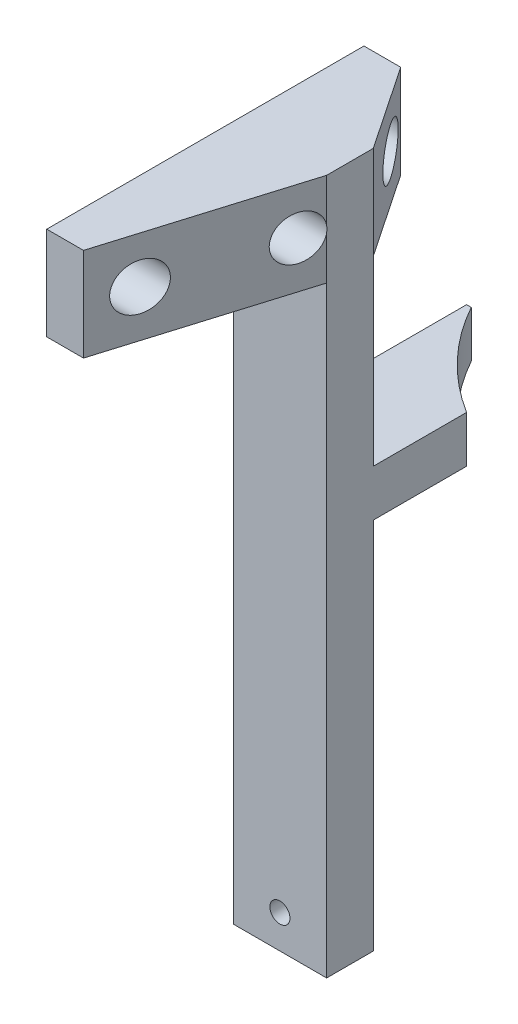
ISO-10303-21;
HEADER;
FILE_DESCRIPTION(('STEP AP214'),'2;1');
FILE_NAME('part.step','',(''),(''),'','','');
FILE_SCHEMA(('AUTOMOTIVE_DESIGN { 1 0 10303 214 1 1 1 1 }'));
ENDSEC;
DATA;
#1=APPLICATION_CONTEXT('core data for automotive mechanical design processes');
#2=APPLICATION_PROTOCOL_DEFINITION('international standard','automotive_design',2000,#1);
#3=PRODUCT_CONTEXT('',#1,'mechanical');
#4=PRODUCT('Part','Part','',(#3));
#5=PRODUCT_RELATED_PRODUCT_CATEGORY('part','',(#4));
#6=PRODUCT_DEFINITION_FORMATION('','',#4);
#7=PRODUCT_DEFINITION_CONTEXT('part definition',#1,'design');
#8=PRODUCT_DEFINITION('design','',#6,#7);
#9=PRODUCT_DEFINITION_SHAPE('','',#8);
#10=(LENGTH_UNIT() NAMED_UNIT(*) SI_UNIT(.MILLI.,.METRE.));
#11=(NAMED_UNIT(*) PLANE_ANGLE_UNIT() SI_UNIT($,.RADIAN.));
#12=(NAMED_UNIT(*) SI_UNIT($,.STERADIAN.) SOLID_ANGLE_UNIT());
#13=UNCERTAINTY_MEASURE_WITH_UNIT(LENGTH_MEASURE(1.E-05),#10,'distance_accuracy_value','');
#14=(GEOMETRIC_REPRESENTATION_CONTEXT(3) GLOBAL_UNCERTAINTY_ASSIGNED_CONTEXT((#13)) GLOBAL_UNIT_ASSIGNED_CONTEXT((#10,
#11,#12)) REPRESENTATION_CONTEXT('',''));
#15=CARTESIAN_POINT('',(0.,0.,0.));
#16=DIRECTION('',(0.,0.,1.));
#17=DIRECTION('',(1.,0.,0.));
#18=AXIS2_PLACEMENT_3D('',#15,#16,#17);
#19=CARTESIAN_POINT('',(0.,0.,0.));
#20=DIRECTION('',(0.,0.,1.));
#21=DIRECTION('',(1.,0.,0.));
#22=AXIS2_PLACEMENT_3D('',#19,#20,#21);
#23=PLANE('',#22);
#24=CARTESIAN_POINT('',(20.,-124.653388527127,0.));
#25=DIRECTION('',(0.,0.,1.));
#26=DIRECTION('',(1.,0.,0.));
#27=AXIS2_PLACEMENT_3D('',#24,#25,#26);
#28=CIRCLE('',#27,2.15);
#29=CARTESIAN_POINT('',(22.15,-124.653388527127,0.));
#30=VERTEX_POINT('',#29);
#31=EDGE_CURVE('E249',#30,#30,#28,.T.);
#32=ORIENTED_EDGE('',*,*,#31,.T.);
#33=EDGE_LOOP('',(#32));
#34=FACE_BOUND('',#33,.T.);
#35=DIRECTION('',(-1.,0.,0.));
#36=VECTOR('',#35,1.);
#37=CARTESIAN_POINT('',(30.0137626059961,-51.8033885271269,0.));
#38=LINE('',#37,#36);
#39=CARTESIAN_POINT('',(30.0137626059961,-51.8033885271269,0.));
#40=VERTEX_POINT('',#39);
#41=CARTESIAN_POINT('',(10.0137626059961,-51.8033885271269,0.));
#42=VERTEX_POINT('',#41);
#43=EDGE_CURVE('E336',#40,#42,#38,.T.);
#44=ORIENTED_EDGE('',*,*,#43,.F.);
#45=DIRECTION('',(0.,1.,0.));
#46=VECTOR('',#45,1.);
#47=CARTESIAN_POINT('',(30.0137626059961,17.2116114728731,0.));
#48=LINE('',#47,#46);
#49=CARTESIAN_POINT('',(30.0137626059961,-131.803388527127,0.));
#50=VERTEX_POINT('',#49);
#51=EDGE_CURVE('E166',#50,#40,#48,.T.);
#52=ORIENTED_EDGE('',*,*,#51,.F.);
#53=DIRECTION('',(1.,0.,0.));
#54=VECTOR('',#53,1.);
#55=CARTESIAN_POINT('',(10.0137626059961,-131.803388527127,0.));
#56=LINE('',#55,#54);
#57=CARTESIAN_POINT('',(10.0137626059961,-131.803388527127,0.));
#58=VERTEX_POINT('',#57);
#59=EDGE_CURVE('E266',#58,#50,#56,.T.);
#60=ORIENTED_EDGE('',*,*,#59,.F.);
#61=DIRECTION('',(0.,-1.,0.));
#62=VECTOR('',#61,1.);
#63=CARTESIAN_POINT('',(10.0137626059961,17.2116114728731,0.));
#64=LINE('',#63,#62);
#65=EDGE_CURVE('E253',#42,#58,#64,.T.);
#66=ORIENTED_EDGE('',*,*,#65,.F.);
#67=EDGE_LOOP('',(#44,#52,#60,#66));
#68=FACE_BOUND('',#67,.T.);
#69=ADVANCED_FACE('F39',(#34,#68),#23,.F.);
#70=DIRECTION('',(1.,0.,0.));
#71=VECTOR('',#70,1.);
#72=CARTESIAN_POINT('',(30.0137626059961,-41.8033885271269,0.));
#73=LINE('',#72,#71);
#74=CARTESIAN_POINT('',(10.0137626059961,-41.8033885271269,0.));
#75=VERTEX_POINT('',#74);
#76=CARTESIAN_POINT('',(30.0137626059961,-41.8033885271269,0.));
#77=VERTEX_POINT('',#76);
#78=EDGE_CURVE('E322',#75,#77,#73,.T.);
#79=ORIENTED_EDGE('',*,*,#78,.F.);
#80=CARTESIAN_POINT('',(10.0137626059961,-2.78838852712688,0.));
#81=VERTEX_POINT('',#80);
#82=EDGE_CURVE('E263',#81,#75,#64,.T.);
#83=ORIENTED_EDGE('',*,*,#82,.F.);
#84=DIRECTION('',(-1.,0.,0.));
#85=VECTOR('',#84,1.);
#86=CARTESIAN_POINT('',(30.0137626059961,-2.78838852712688,0.));
#87=LINE('',#86,#85);
#88=CARTESIAN_POINT('',(30.0137626059961,-2.78838852712688,0.));
#89=VERTEX_POINT('',#88);
#90=EDGE_CURVE('E221',#89,#81,#87,.T.);
#91=ORIENTED_EDGE('',*,*,#90,.F.);
#92=EDGE_CURVE('E268',#77,#89,#48,.T.);
#93=ORIENTED_EDGE('',*,*,#92,.F.);
#94=EDGE_LOOP('',(#79,#83,#91,#93));
#95=FACE_BOUND('',#94,.T.);
#96=ADVANCED_FACE('F321',(#95),#23,.F.);
#97=CARTESIAN_POINT('',(30.0137626059961,17.2116114728731,10.));
#98=DIRECTION('',(-1.,0.,0.));
#99=DIRECTION('',(0.,-1.,0.));
#100=AXIS2_PLACEMENT_3D('',#97,#98,#99);
#101=PLANE('',#100);
#102=DIRECTION('',(0.,0.,1.));
#103=VECTOR('',#102,1.);
#104=CARTESIAN_POINT('',(30.0137626059961,-51.8033885271269,-40.));
#105=LINE('',#104,#103);
#106=CARTESIAN_POINT('',(30.0137626059961,-51.8033885271269,-20.));
#107=VERTEX_POINT('',#106);
#108=EDGE_CURVE('E158',#107,#40,#105,.T.);
#109=ORIENTED_EDGE('',*,*,#108,.F.);
#110=DIRECTION('',(0.,1.,0.));
#111=VECTOR('',#110,1.);
#112=CARTESIAN_POINT('',(30.0137626059961,-131.804388527127,-20.));
#113=LINE('',#112,#111);
#114=CARTESIAN_POINT('',(30.0137626059961,-41.8033885271269,-20.));
#115=VERTEX_POINT('',#114);
#116=EDGE_CURVE('E146',#107,#115,#113,.T.);
#117=ORIENTED_EDGE('',*,*,#116,.T.);
#118=DIRECTION('',(0.,0.,1.));
#119=VECTOR('',#118,1.);
#120=CARTESIAN_POINT('',(30.0137626059961,-41.8033885271269,-40.));
#121=LINE('',#120,#119);
#122=EDGE_CURVE('E317',#115,#77,#121,.T.);
#123=ORIENTED_EDGE('',*,*,#122,.T.);
#124=ORIENTED_EDGE('',*,*,#92,.T.);
#125=DIRECTION('',(0.,1.,0.));
#126=VECTOR('',#125,1.);
#127=CARTESIAN_POINT('',(30.0137626059961,-12.7883885271269,0.));
#128=LINE('',#127,#126);
#129=CARTESIAN_POINT('',(30.0137626059961,17.2116114728731,0.));
#130=VERTEX_POINT('',#129);
#131=EDGE_CURVE('E203',#89,#130,#128,.T.);
#132=ORIENTED_EDGE('',*,*,#131,.T.);
#133=DIRECTION('',(0.,0.,-1.));
#134=VECTOR('',#133,1.);
#135=CARTESIAN_POINT('',(30.0137626059961,17.2116114728731,10.));
#136=LINE('',#135,#134);
#137=CARTESIAN_POINT('',(30.0137626059961,17.2116114728731,10.));
#138=VERTEX_POINT('',#137);
#139=EDGE_CURVE('E271',#138,#130,#136,.T.);
#140=ORIENTED_EDGE('',*,*,#139,.F.);
#141=DIRECTION('',(0.,1.,0.));
#142=VECTOR('',#141,1.);
#143=CARTESIAN_POINT('',(30.0137626059961,-12.7883885271269,10.));
#144=LINE('',#143,#142);
#145=CARTESIAN_POINT('',(30.0137626059961,7.89899782711648,10.));
#146=VERTEX_POINT('',#145);
#147=EDGE_CURVE('E207',#146,#138,#144,.T.);
#148=ORIENTED_EDGE('',*,*,#147,.F.);
#149=CARTESIAN_POINT('',(30.0137626059961,7.2116114728731,14.7));
#150=DIRECTION('',(-1.,0.,0.));
#151=DIRECTION('',(0.,-1.,0.));
#152=AXIS2_PLACEMENT_3D('',#149,#150,#151);
#153=CIRCLE('',#152,4.75);
#154=CARTESIAN_POINT('',(30.0137626059961,6.52422511862971,10.));
#155=VERTEX_POINT('',#154);
#156=EDGE_CURVE('E181',#146,#155,#153,.T.);
#157=ORIENTED_EDGE('',*,*,#156,.T.);
#158=CARTESIAN_POINT('',(30.0137626059961,-2.78838852712688,10.));
#159=VERTEX_POINT('',#158);
#160=EDGE_CURVE('E209',#159,#155,#144,.T.);
#161=ORIENTED_EDGE('',*,*,#160,.F.);
#162=DIRECTION('',(0.,1.,0.));
#163=VECTOR('',#162,1.);
#164=CARTESIAN_POINT('',(30.0137626059961,17.2116114728731,10.));
#165=LINE('',#164,#163);
#166=CARTESIAN_POINT('',(30.0137626059961,-131.803388527127,10.));
#167=VERTEX_POINT('',#166);
#168=EDGE_CURVE('E260',#167,#159,#165,.T.);
#169=ORIENTED_EDGE('',*,*,#168,.F.);
#170=DIRECTION('',(0.,0.,-1.));
#171=VECTOR('',#170,1.);
#172=CARTESIAN_POINT('',(30.0137626059961,-131.803388527127,10.));
#173=LINE('',#172,#171);
#174=EDGE_CURVE('E274',#167,#50,#173,.T.);
#175=ORIENTED_EDGE('',*,*,#174,.T.);
#176=ORIENTED_EDGE('',*,*,#51,.T.);
#177=EDGE_LOOP('',(#109,#117,#123,#124,#132,#140,#148,#157,#161,#169,#175,#176));
#178=FACE_BOUND('',#177,.T.);
#179=ADVANCED_FACE('F163',(#178),#101,.F.);
#180=CARTESIAN_POINT('',(10.0137626059961,17.2116114728731,10.));
#181=DIRECTION('',(0.,-1.,0.));
#182=DIRECTION('',(0.,0.,-1.));
#183=AXIS2_PLACEMENT_3D('',#180,#181,#182);
#184=PLANE('',#183);
#185=DIRECTION('',(0.289980833294845,0.,-0.957032453118298));
#186=VECTOR('',#185,1.);
#187=CARTESIAN_POINT('',(30.0137626059961,17.2116114728731,10.));
#188=LINE('',#187,#186);
#189=CARTESIAN_POINT('',(17.8937626059961,17.2116114728731,50.));
#190=VERTEX_POINT('',#189);
#191=EDGE_CURVE('E204',#190,#138,#188,.T.);
#192=ORIENTED_EDGE('',*,*,#191,.T.);
#193=ORIENTED_EDGE('',*,*,#139,.T.);
#194=DIRECTION('',(-0.558522736207715,0.,-0.829489212189675));
#195=VECTOR('',#194,1.);
#196=CARTESIAN_POINT('',(30.0137626059961,17.2116114728731,0.));
#197=LINE('',#196,#195);
#198=CARTESIAN_POINT('',(17.8937626059961,17.2116114728731,-18.));
#199=VERTEX_POINT('',#198);
#200=EDGE_CURVE('E208',#130,#199,#197,.T.);
#201=ORIENTED_EDGE('',*,*,#200,.T.);
#202=DIRECTION('',(1.,0.,0.));
#203=VECTOR('',#202,1.);
#204=CARTESIAN_POINT('',(30.0137626059961,17.2116114728731,-18.));
#205=LINE('',#204,#203);
#206=CARTESIAN_POINT('',(10.0137626059961,17.2116114728731,-18.));
#207=VERTEX_POINT('',#206);
#208=EDGE_CURVE('E227',#207,#199,#205,.T.);
#209=ORIENTED_EDGE('',*,*,#208,.F.);
#210=DIRECTION('',(0.,0.,-1.));
#211=VECTOR('',#210,1.);
#212=CARTESIAN_POINT('',(10.0137626059961,17.2116114728731,10.));
#213=LINE('',#212,#211);
#214=CARTESIAN_POINT('',(10.0137626059961,17.2116114728731,50.));
#215=VERTEX_POINT('',#214);
#216=EDGE_CURVE('E262',#215,#207,#213,.T.);
#217=ORIENTED_EDGE('',*,*,#216,.F.);
#218=DIRECTION('',(-1.,0.,0.));
#219=VECTOR('',#218,1.);
#220=CARTESIAN_POINT('',(10.0137626059961,17.2116114728731,50.));
#221=LINE('',#220,#219);
#222=EDGE_CURVE('E242',#190,#215,#221,.T.);
#223=ORIENTED_EDGE('',*,*,#222,.F.);
#224=EDGE_LOOP('',(#192,#193,#201,#209,#217,#223));
#225=FACE_BOUND('',#224,.T.);
#226=ADVANCED_FACE('F312',(#225),#184,.F.);
#227=CARTESIAN_POINT('',(10.0137626059961,-2.78838852712688,50.));
#228=DIRECTION('',(0.,1.,0.));
#229=DIRECTION('',(0.,0.,1.));
#230=AXIS2_PLACEMENT_3D('',#227,#228,#229);
#231=PLANE('',#230);
#232=DIRECTION('',(0.289980833294845,0.,-0.957032453118298));
#233=VECTOR('',#232,1.);
#234=CARTESIAN_POINT('',(17.2311422026105,-2.78838852712688,52.1868660177742));
#235=LINE('',#234,#233);
#236=CARTESIAN_POINT('',(17.8937626059961,-2.78838852712688,50.));
#237=VERTEX_POINT('',#236);
#238=EDGE_CURVE('E218',#237,#159,#235,.T.);
#239=ORIENTED_EDGE('',*,*,#238,.F.);
#240=DIRECTION('',(1.,0.,0.));
#241=VECTOR('',#240,1.);
#242=CARTESIAN_POINT('',(10.0137626059961,-2.78838852712688,50.));
#243=LINE('',#242,#241);
#244=CARTESIAN_POINT('',(10.0137626059961,-2.78838852712688,50.));
#245=VERTEX_POINT('',#244);
#246=EDGE_CURVE('E239',#245,#237,#243,.T.);
#247=ORIENTED_EDGE('',*,*,#246,.F.);
#248=DIRECTION('',(0.,0.,-1.));
#249=VECTOR('',#248,1.);
#250=CARTESIAN_POINT('',(10.0137626059961,-2.78838852712688,50.));
#251=LINE('',#250,#249);
#252=CARTESIAN_POINT('',(10.0137626059961,-2.78838852712688,10.));
#253=VERTEX_POINT('',#252);
#254=EDGE_CURVE('E244',#245,#253,#251,.T.);
#255=ORIENTED_EDGE('',*,*,#254,.T.);
#256=DIRECTION('',(1.,0.,0.));
#257=VECTOR('',#256,1.);
#258=CARTESIAN_POINT('',(10.0137626059961,-2.78838852712688,10.));
#259=LINE('',#258,#257);
#260=EDGE_CURVE('E235',#253,#159,#259,.T.);
#261=ORIENTED_EDGE('',*,*,#260,.T.);
#262=EDGE_LOOP('',(#239,#247,#255,#261));
#263=FACE_BOUND('',#262,.T.);
#264=ADVANCED_FACE('F363',(#263),#231,.F.);
#265=CARTESIAN_POINT('',(0.,0.,50.));
#266=DIRECTION('',(0.,0.,1.));
#267=DIRECTION('',(1.,0.,0.));
#268=AXIS2_PLACEMENT_3D('',#265,#266,#267);
#269=PLANE('',#268);
#270=ORIENTED_EDGE('',*,*,#246,.T.);
#271=DIRECTION('',(0.,1.,0.));
#272=VECTOR('',#271,1.);
#273=CARTESIAN_POINT('',(17.8937626059961,0.,50.));
#274=LINE('',#273,#272);
#275=EDGE_CURVE('E48',#237,#190,#274,.T.);
#276=ORIENTED_EDGE('',*,*,#275,.T.);
#277=ORIENTED_EDGE('',*,*,#222,.T.);
#278=DIRECTION('',(0.,-1.,0.));
#279=VECTOR('',#278,1.);
#280=CARTESIAN_POINT('',(10.0137626059961,17.2116114728731,50.));
#281=LINE('',#280,#279);
#282=EDGE_CURVE('E236',#215,#245,#281,.T.);
#283=ORIENTED_EDGE('',*,*,#282,.T.);
#284=EDGE_LOOP('',(#270,#276,#277,#283));
#285=FACE_BOUND('',#284,.T.);
#286=ADVANCED_FACE('F387',(#285),#269,.T.);
#287=CARTESIAN_POINT('',(30.0137626059961,-2.78838852712688,-18.));
#288=DIRECTION('',(0.,1.,0.));
#289=DIRECTION('',(0.,0.,1.));
#290=AXIS2_PLACEMENT_3D('',#287,#288,#289);
#291=PLANE('',#290);
#292=DIRECTION('',(-0.558522736207715,0.,-0.829489212189675));
#293=VECTOR('',#292,1.);
#294=CARTESIAN_POINT('',(21.6745680859508,-2.78838852712688,-12.3849423565028));
#295=LINE('',#294,#293);
#296=CARTESIAN_POINT('',(17.893762605996,-2.78838852712688,-18.));
#297=VERTEX_POINT('',#296);
#298=EDGE_CURVE('E212',#89,#297,#295,.T.);
#299=ORIENTED_EDGE('',*,*,#298,.F.);
#300=ORIENTED_EDGE('',*,*,#90,.T.);
#301=DIRECTION('',(0.,0.,1.));
#302=VECTOR('',#301,1.);
#303=CARTESIAN_POINT('',(10.0137626059961,-2.78838852712688,-18.));
#304=LINE('',#303,#302);
#305=CARTESIAN_POINT('',(10.0137626059961,-2.78838852712688,-18.));
#306=VERTEX_POINT('',#305);
#307=EDGE_CURVE('E230',#306,#81,#304,.T.);
#308=ORIENTED_EDGE('',*,*,#307,.F.);
#309=DIRECTION('',(-1.,0.,0.));
#310=VECTOR('',#309,1.);
#311=CARTESIAN_POINT('',(30.0137626059961,-2.78838852712688,-18.));
#312=LINE('',#311,#310);
#313=EDGE_CURVE('E222',#297,#306,#312,.T.);
#314=ORIENTED_EDGE('',*,*,#313,.F.);
#315=EDGE_LOOP('',(#299,#300,#308,#314));
#316=FACE_BOUND('',#315,.T.);
#317=ADVANCED_FACE('F307',(#316),#291,.F.);
#318=CARTESIAN_POINT('',(0.,0.,-18.));
#319=DIRECTION('',(0.,0.,-1.));
#320=DIRECTION('',(-1.,0.,0.));
#321=AXIS2_PLACEMENT_3D('',#318,#319,#320);
#322=PLANE('',#321);
#323=ORIENTED_EDGE('',*,*,#208,.T.);
#324=DIRECTION('',(0.,-1.,0.));
#325=VECTOR('',#324,1.);
#326=CARTESIAN_POINT('',(17.893762605996,0.,-18.));
#327=LINE('',#326,#325);
#328=EDGE_CURVE('E279',#199,#297,#327,.T.);
#329=ORIENTED_EDGE('',*,*,#328,.T.);
#330=ORIENTED_EDGE('',*,*,#313,.T.);
#331=DIRECTION('',(0.,1.,0.));
#332=VECTOR('',#331,1.);
#333=CARTESIAN_POINT('',(10.0137626059961,17.2116114728731,-18.));
#334=LINE('',#333,#332);
#335=EDGE_CURVE('E224',#306,#207,#334,.T.);
#336=ORIENTED_EDGE('',*,*,#335,.T.);
#337=EDGE_LOOP('',(#323,#329,#330,#336));
#338=FACE_BOUND('',#337,.T.);
#339=ADVANCED_FACE('F304',(#338),#322,.T.);
#340=CARTESIAN_POINT('',(0.,0.,10.));
#341=DIRECTION('',(0.,0.,1.));
#342=DIRECTION('',(1.,0.,0.));
#343=AXIS2_PLACEMENT_3D('',#340,#341,#342);
#344=PLANE('',#343);
#345=ORIENTED_EDGE('',*,*,#260,.F.);
#346=DIRECTION('',(0.,-1.,0.));
#347=VECTOR('',#346,1.);
#348=CARTESIAN_POINT('',(10.0137626059961,17.2116114728731,10.));
#349=LINE('',#348,#347);
#350=CARTESIAN_POINT('',(10.0137626059961,-131.803388527127,10.));
#351=VERTEX_POINT('',#350);
#352=EDGE_CURVE('E256',#253,#351,#349,.T.);
#353=ORIENTED_EDGE('',*,*,#352,.T.);
#354=DIRECTION('',(1.,0.,0.));
#355=VECTOR('',#354,1.);
#356=CARTESIAN_POINT('',(10.0137626059961,-131.803388527127,10.));
#357=LINE('',#356,#355);
#358=EDGE_CURVE('E258',#351,#167,#357,.T.);
#359=ORIENTED_EDGE('',*,*,#358,.T.);
#360=ORIENTED_EDGE('',*,*,#168,.T.);
#361=EDGE_LOOP('',(#345,#353,#359,#360));
#362=FACE_BOUND('',#361,.T.);
#363=CARTESIAN_POINT('',(20.,-124.653388527127,10.));
#364=DIRECTION('',(0.,0.,1.));
#365=DIRECTION('',(1.,0.,0.));
#366=AXIS2_PLACEMENT_3D('',#363,#364,#365);
#367=CIRCLE('',#366,2.15);
#368=CARTESIAN_POINT('',(22.15,-124.653388527127,10.));
#369=VERTEX_POINT('',#368);
#370=EDGE_CURVE('E250',#369,#369,#367,.T.);
#371=ORIENTED_EDGE('',*,*,#370,.F.);
#372=EDGE_LOOP('',(#371));
#373=FACE_BOUND('',#372,.T.);
#374=ADVANCED_FACE('F359',(#362,#373),#344,.T.);
#375=CARTESIAN_POINT('',(10.0137626059961,17.2116114728731,10.));
#376=DIRECTION('',(1.,0.,0.));
#377=DIRECTION('',(0.,1.,0.));
#378=AXIS2_PLACEMENT_3D('',#375,#376,#377);
#379=PLANE('',#378);
#380=CARTESIAN_POINT('',(10.0137626059961,7.21161147287312,40.7));
#381=DIRECTION('',(-1.,0.,0.));
#382=DIRECTION('',(0.,-1.,0.));
#383=AXIS2_PLACEMENT_3D('',#380,#381,#382);
#384=CIRCLE('',#383,2.2);
#385=CARTESIAN_POINT('',(10.0137626059961,5.01161147287312,40.7));
#386=VERTEX_POINT('',#385);
#387=EDGE_CURVE('E189',#386,#386,#384,.T.);
#388=ORIENTED_EDGE('',*,*,#387,.F.);
#389=EDGE_LOOP('',(#388));
#390=FACE_BOUND('',#389,.T.);
#391=CARTESIAN_POINT('',(10.0137626059961,7.2116114728731,-11.3));
#392=DIRECTION('',(-1.,0.,0.));
#393=DIRECTION('',(0.,-1.,0.));
#394=AXIS2_PLACEMENT_3D('',#391,#392,#393);
#395=CIRCLE('',#394,2.2);
#396=CARTESIAN_POINT('',(10.0137626059961,5.0116114728731,-11.3));
#397=VERTEX_POINT('',#396);
#398=EDGE_CURVE('E185',#397,#397,#395,.T.);
#399=ORIENTED_EDGE('',*,*,#398,.F.);
#400=EDGE_LOOP('',(#399));
#401=FACE_BOUND('',#400,.T.);
#402=CARTESIAN_POINT('',(10.0137626059961,7.2116114728731,14.7));
#403=DIRECTION('',(-1.,0.,0.));
#404=DIRECTION('',(0.,-1.,0.));
#405=AXIS2_PLACEMENT_3D('',#402,#403,#404);
#406=CIRCLE('',#405,2.2);
#407=CARTESIAN_POINT('',(10.0137626059961,5.0116114728731,14.7));
#408=VERTEX_POINT('',#407);
#409=EDGE_CURVE('E188',#408,#408,#406,.T.);
#410=ORIENTED_EDGE('',*,*,#409,.F.);
#411=EDGE_LOOP('',(#410));
#412=FACE_BOUND('',#411,.T.);
#413=ORIENTED_EDGE('',*,*,#216,.T.);
#414=ORIENTED_EDGE('',*,*,#335,.F.);
#415=ORIENTED_EDGE('',*,*,#307,.T.);
#416=ORIENTED_EDGE('',*,*,#82,.T.);
#417=DIRECTION('',(0.,0.,1.));
#418=VECTOR('',#417,1.);
#419=CARTESIAN_POINT('',(10.0137626059961,-41.8033885271269,-40.));
#420=LINE('',#419,#418);
#421=CARTESIAN_POINT('',(10.0137626059961,-41.8033885271269,-40.));
#422=VERTEX_POINT('',#421);
#423=EDGE_CURVE('E172',#422,#75,#420,.T.);
#424=ORIENTED_EDGE('',*,*,#423,.F.);
#425=DIRECTION('',(0.,1.,0.));
#426=VECTOR('',#425,1.);
#427=CARTESIAN_POINT('',(10.0137626059961,-41.8033885271269,-40.));
#428=LINE('',#427,#426);
#429=CARTESIAN_POINT('',(10.0137626059961,-51.8033885271269,-40.));
#430=VERTEX_POINT('',#429);
#431=EDGE_CURVE('E325',#430,#422,#428,.T.);
#432=ORIENTED_EDGE('',*,*,#431,.F.);
#433=DIRECTION('',(0.,0.,1.));
#434=VECTOR('',#433,1.);
#435=CARTESIAN_POINT('',(10.0137626059961,-51.8033885271269,-40.));
#436=LINE('',#435,#434);
#437=EDGE_CURVE('E64',#430,#42,#436,.T.);
#438=ORIENTED_EDGE('',*,*,#437,.T.);
#439=ORIENTED_EDGE('',*,*,#65,.T.);
#440=DIRECTION('',(0.,0.,-1.));
#441=VECTOR('',#440,1.);
#442=CARTESIAN_POINT('',(10.0137626059961,-131.803388527127,10.));
#443=LINE('',#442,#441);
#444=EDGE_CURVE('E276',#351,#58,#443,.T.);
#445=ORIENTED_EDGE('',*,*,#444,.F.);
#446=ORIENTED_EDGE('',*,*,#352,.F.);
#447=ORIENTED_EDGE('',*,*,#254,.F.);
#448=ORIENTED_EDGE('',*,*,#282,.F.);
#449=EDGE_LOOP('',(#413,#414,#415,#416,#424,#432,#438,#439,#445,#446,#447,#448));
#450=FACE_BOUND('',#449,.T.);
#451=ADVANCED_FACE('F41',(#390,#401,#412,#450),#379,.F.);
#452=CARTESIAN_POINT('',(10.0137626059961,-131.803388527127,10.));
#453=DIRECTION('',(0.,1.,0.));
#454=DIRECTION('',(0.,0.,1.));
#455=AXIS2_PLACEMENT_3D('',#452,#453,#454);
#456=PLANE('',#455);
#457=ORIENTED_EDGE('',*,*,#59,.T.);
#458=ORIENTED_EDGE('',*,*,#174,.F.);
#459=ORIENTED_EDGE('',*,*,#358,.F.);
#460=ORIENTED_EDGE('',*,*,#444,.T.);
#461=EDGE_LOOP('',(#457,#458,#459,#460));
#462=FACE_BOUND('',#461,.T.);
#463=ADVANCED_FACE('F365',(#462),#456,.F.);
#464=CARTESIAN_POINT('',(20.,-124.653388527127,10.));
#465=DIRECTION('',(0.,0.,-1.));
#466=DIRECTION('',(-1.,0.,0.));
#467=AXIS2_PLACEMENT_3D('',#464,#465,#466);
#468=CYLINDRICAL_SURFACE('',#467,2.15);
#469=ORIENTED_EDGE('',*,*,#370,.T.);
#470=EDGE_LOOP('',(#469));
#471=FACE_BOUND('',#470,.T.);
#472=ORIENTED_EDGE('',*,*,#31,.F.);
#473=EDGE_LOOP('',(#472));
#474=FACE_BOUND('',#473,.T.);
#475=ADVANCED_FACE('F296',(#471,#474),#468,.F.);
#476=CARTESIAN_POINT('',(30.0137626059961,-12.7883885271269,0.));
#477=DIRECTION('',(0.829489212189675,0.,-0.558522736207715));
#478=DIRECTION('',(-0.558522736207715,0.,-0.829489212189675));
#479=AXIS2_PLACEMENT_3D('',#476,#477,#478);
#480=PLANE('',#479);
#481=CARTESIAN_POINT('',(22.4050959393294,7.2116114728731,-11.3));
#482=DIRECTION('',(0.829489212189675,0.,-0.558522736207715));
#483=DIRECTION('',(-0.558522736207715,0.,-0.829489212189675));
#484=AXIS2_PLACEMENT_3D('',#481,#482,#483);
#485=ELLIPSE('',#484,6.02780593951435,5.);
#486=CARTESIAN_POINT('',(19.0384292726627,7.2116114728731,-16.3));
#487=VERTEX_POINT('',#486);
#488=EDGE_CURVE('E43',#487,#487,#485,.T.);
#489=ORIENTED_EDGE('',*,*,#488,.F.);
#490=EDGE_LOOP('',(#489));
#491=FACE_BOUND('',#490,.T.);
#492=ORIENTED_EDGE('',*,*,#298,.T.);
#493=ORIENTED_EDGE('',*,*,#328,.F.);
#494=ORIENTED_EDGE('',*,*,#200,.F.);
#495=ORIENTED_EDGE('',*,*,#131,.F.);
#496=EDGE_LOOP('',(#492,#493,#494,#495));
#497=FACE_BOUND('',#496,.T.);
#498=ADVANCED_FACE('F292',(#491,#497),#480,.T.);
#499=CARTESIAN_POINT('',(30.0137626059961,-12.7883885271269,10.));
#500=DIRECTION('',(0.957032453118298,0.,0.289980833294845));
#501=DIRECTION('',(0.289980833294845,0.,-0.957032453118298));
#502=AXIS2_PLACEMENT_3D('',#499,#500,#501);
#503=PLANE('',#502);
#504=CARTESIAN_POINT('',(20.7116626059961,7.21161147287312,40.7));
#505=DIRECTION('',(0.957032453118298,0.,0.289980833294845));
#506=DIRECTION('',(-0.289980833294845,0.,0.957032453118298));
#507=AXIS2_PLACEMENT_3D('',#504,#505,#506);
#508=ELLIPSE('',#507,5.22448322803318,5.);
#509=CARTESIAN_POINT('',(19.1966626059961,7.21161147287311,45.7));
#510=VERTEX_POINT('',#509);
#511=EDGE_CURVE('E184',#510,#510,#508,.T.);
#512=ORIENTED_EDGE('',*,*,#511,.F.);
#513=EDGE_LOOP('',(#512));
#514=FACE_BOUND('',#513,.T.);
#515=CARTESIAN_POINT('',(28.5896626059961,7.2116114728731,14.7));
#516=DIRECTION('',(0.957032453118298,0.,0.289980833294845));
#517=DIRECTION('',(-0.289980833294845,0.,0.957032453118298));
#518=AXIS2_PLACEMENT_3D('',#515,#516,#517);
#519=ELLIPSE('',#518,4.96325906663152,4.75);
#520=EDGE_CURVE('E11',#146,#155,#519,.T.);
#521=ORIENTED_EDGE('',*,*,#520,.F.);
#522=ORIENTED_EDGE('',*,*,#147,.T.);
#523=ORIENTED_EDGE('',*,*,#191,.F.);
#524=ORIENTED_EDGE('',*,*,#275,.F.);
#525=ORIENTED_EDGE('',*,*,#238,.T.);
#526=ORIENTED_EDGE('',*,*,#160,.T.);
#527=EDGE_LOOP('',(#521,#522,#523,#524,#525,#526));
#528=FACE_BOUND('',#527,.T.);
#529=ADVANCED_FACE('F295',(#514,#528),#503,.T.);
#530=CARTESIAN_POINT('',(12.0137626059961,7.2116114728731,14.7));
#531=DIRECTION('',(-1.,0.,0.));
#532=DIRECTION('',(0.,-1.,0.));
#533=AXIS2_PLACEMENT_3D('',#530,#531,#532);
#534=CYLINDRICAL_SURFACE('',#533,2.2);
#535=CARTESIAN_POINT('',(12.0137626059961,7.2116114728731,14.7));
#536=DIRECTION('',(-1.,0.,0.));
#537=DIRECTION('',(0.,-1.,0.));
#538=AXIS2_PLACEMENT_3D('',#535,#536,#537);
#539=CIRCLE('',#538,2.2);
#540=CARTESIAN_POINT('',(12.0137626059961,5.0116114728731,14.7));
#541=VERTEX_POINT('',#540);
#542=EDGE_CURVE('E193',#541,#541,#539,.T.);
#543=ORIENTED_EDGE('',*,*,#542,.F.);
#544=EDGE_LOOP('',(#543));
#545=FACE_BOUND('',#544,.T.);
#546=ORIENTED_EDGE('',*,*,#409,.T.);
#547=EDGE_LOOP('',(#546));
#548=FACE_BOUND('',#547,.T.);
#549=ADVANCED_FACE('F411',(#545,#548),#534,.F.);
#550=CARTESIAN_POINT('',(12.0137626059961,7.2116114728731,-11.3));
#551=DIRECTION('',(-1.,0.,0.));
#552=DIRECTION('',(0.,-1.,0.));
#553=AXIS2_PLACEMENT_3D('',#550,#551,#552);
#554=CYLINDRICAL_SURFACE('',#553,2.2);
#555=CARTESIAN_POINT('',(12.0137626059961,7.2116114728731,-11.3));
#556=DIRECTION('',(-1.,0.,0.));
#557=DIRECTION('',(0.,-1.,0.));
#558=AXIS2_PLACEMENT_3D('',#555,#556,#557);
#559=CIRCLE('',#558,2.2);
#560=CARTESIAN_POINT('',(12.0137626059961,5.0116114728731,-11.3));
#561=VERTEX_POINT('',#560);
#562=EDGE_CURVE('E190',#561,#561,#559,.T.);
#563=ORIENTED_EDGE('',*,*,#562,.F.);
#564=EDGE_LOOP('',(#563));
#565=FACE_BOUND('',#564,.T.);
#566=ORIENTED_EDGE('',*,*,#398,.T.);
#567=EDGE_LOOP('',(#566));
#568=FACE_BOUND('',#567,.T.);
#569=ADVANCED_FACE('F405',(#565,#568),#554,.F.);
#570=CARTESIAN_POINT('',(12.0137626059961,7.21161147287312,40.7));
#571=DIRECTION('',(-1.,0.,0.));
#572=DIRECTION('',(0.,-1.,0.));
#573=AXIS2_PLACEMENT_3D('',#570,#571,#572);
#574=CYLINDRICAL_SURFACE('',#573,2.2);
#575=CARTESIAN_POINT('',(12.0137626059961,7.21161147287312,40.7));
#576=DIRECTION('',(-1.,0.,0.));
#577=DIRECTION('',(0.,-1.,0.));
#578=AXIS2_PLACEMENT_3D('',#575,#576,#577);
#579=CIRCLE('',#578,2.2);
#580=CARTESIAN_POINT('',(12.0137626059961,5.01161147287312,40.7));
#581=VERTEX_POINT('',#580);
#582=EDGE_CURVE('E194',#581,#581,#579,.T.);
#583=ORIENTED_EDGE('',*,*,#582,.F.);
#584=EDGE_LOOP('',(#583));
#585=FACE_BOUND('',#584,.T.);
#586=ORIENTED_EDGE('',*,*,#387,.T.);
#587=EDGE_LOOP('',(#586));
#588=FACE_BOUND('',#587,.T.);
#589=ADVANCED_FACE('F394',(#585,#588),#574,.F.);
#590=CARTESIAN_POINT('',(32.0137626059961,7.2116114728731,14.7));
#591=DIRECTION('',(-1.,0.,0.));
#592=DIRECTION('',(0.,-1.,0.));
#593=AXIS2_PLACEMENT_3D('',#590,#591,#592);
#594=CYLINDRICAL_SURFACE('',#593,4.75);
#595=CARTESIAN_POINT('',(12.0137626059961,7.2116114728731,14.7));
#596=DIRECTION('',(-1.,0.,0.));
#597=DIRECTION('',(0.,-1.,0.));
#598=AXIS2_PLACEMENT_3D('',#595,#596,#597);
#599=CIRCLE('',#598,4.75);
#600=CARTESIAN_POINT('',(12.0137626059961,2.4616114728731,14.7));
#601=VERTEX_POINT('',#600);
#602=EDGE_CURVE('E177',#601,#601,#599,.T.);
#603=ORIENTED_EDGE('',*,*,#602,.T.);
#604=EDGE_LOOP('',(#603));
#605=FACE_BOUND('',#604,.T.);
#606=ORIENTED_EDGE('',*,*,#520,.T.);
#607=ORIENTED_EDGE('',*,*,#156,.F.);
#608=EDGE_LOOP('',(#606,#607));
#609=FACE_BOUND('',#608,.T.);
#610=ADVANCED_FACE('F391',(#605,#609),#594,.F.);
#611=CARTESIAN_POINT('',(12.0137626059961,7.2116114728731,14.7));
#612=DIRECTION('',(-1.,0.,0.));
#613=DIRECTION('',(0.,-1.,0.));
#614=AXIS2_PLACEMENT_3D('',#611,#612,#613);
#615=PLANE('',#614);
#616=ORIENTED_EDGE('',*,*,#542,.T.);
#617=EDGE_LOOP('',(#616));
#618=FACE_BOUND('',#617,.T.);
#619=ORIENTED_EDGE('',*,*,#602,.F.);
#620=EDGE_LOOP('',(#619));
#621=FACE_BOUND('',#620,.T.);
#622=ADVANCED_FACE('F393',(#618,#621),#615,.F.);
#623=CARTESIAN_POINT('',(32.0137626059961,7.21161147287312,40.7));
#624=DIRECTION('',(-1.,0.,0.));
#625=DIRECTION('',(0.,-1.,0.));
#626=AXIS2_PLACEMENT_3D('',#623,#624,#625);
#627=CYLINDRICAL_SURFACE('',#626,5.);
#628=ORIENTED_EDGE('',*,*,#511,.T.);
#629=EDGE_LOOP('',(#628));
#630=FACE_BOUND('',#629,.T.);
#631=CARTESIAN_POINT('',(12.0137626059961,7.21161147287311,40.7));
#632=DIRECTION('',(-1.,0.,0.));
#633=DIRECTION('',(0.,-1.,0.));
#634=AXIS2_PLACEMENT_3D('',#631,#632,#633);
#635=CIRCLE('',#634,5.);
#636=CARTESIAN_POINT('',(12.0137626059961,2.21161147287312,40.7));
#637=VERTEX_POINT('',#636);
#638=EDGE_CURVE('E170',#637,#637,#635,.T.);
#639=ORIENTED_EDGE('',*,*,#638,.T.);
#640=EDGE_LOOP('',(#639));
#641=FACE_BOUND('',#640,.T.);
#642=ADVANCED_FACE('F401',(#630,#641),#627,.F.);
#643=CARTESIAN_POINT('',(12.0137626059961,7.21161147287311,40.7));
#644=DIRECTION('',(-1.,0.,0.));
#645=DIRECTION('',(0.,-1.,0.));
#646=AXIS2_PLACEMENT_3D('',#643,#644,#645);
#647=PLANE('',#646);
#648=ORIENTED_EDGE('',*,*,#582,.T.);
#649=EDGE_LOOP('',(#648));
#650=FACE_BOUND('',#649,.T.);
#651=ORIENTED_EDGE('',*,*,#638,.F.);
#652=EDGE_LOOP('',(#651));
#653=FACE_BOUND('',#652,.T.);
#654=ADVANCED_FACE('F499',(#650,#653),#647,.F.);
#655=CARTESIAN_POINT('',(32.0137626059961,7.2116114728731,-11.3));
#656=DIRECTION('',(-1.,0.,0.));
#657=DIRECTION('',(0.,-1.,0.));
#658=AXIS2_PLACEMENT_3D('',#655,#656,#657);
#659=CYLINDRICAL_SURFACE('',#658,5.);
#660=ORIENTED_EDGE('',*,*,#488,.T.);
#661=EDGE_LOOP('',(#660));
#662=FACE_BOUND('',#661,.T.);
#663=CARTESIAN_POINT('',(12.0137626059961,7.2116114728731,-11.3));
#664=DIRECTION('',(-1.,0.,0.));
#665=DIRECTION('',(0.,-1.,0.));
#666=AXIS2_PLACEMENT_3D('',#663,#664,#665);
#667=CIRCLE('',#666,5.);
#668=CARTESIAN_POINT('',(12.0137626059961,2.2116114728731,-11.3));
#669=VERTEX_POINT('',#668);
#670=EDGE_CURVE('E167',#669,#669,#667,.T.);
#671=ORIENTED_EDGE('',*,*,#670,.T.);
#672=EDGE_LOOP('',(#671));
#673=FACE_BOUND('',#672,.T.);
#674=ADVANCED_FACE('F289',(#662,#673),#659,.F.);
#675=CARTESIAN_POINT('',(12.0137626059961,7.2116114728731,-11.3));
#676=DIRECTION('',(-1.,0.,0.));
#677=DIRECTION('',(0.,-1.,0.));
#678=AXIS2_PLACEMENT_3D('',#675,#676,#677);
#679=PLANE('',#678);
#680=ORIENTED_EDGE('',*,*,#562,.T.);
#681=EDGE_LOOP('',(#680));
#682=FACE_BOUND('',#681,.T.);
#683=ORIENTED_EDGE('',*,*,#670,.F.);
#684=EDGE_LOOP('',(#683));
#685=FACE_BOUND('',#684,.T.);
#686=ADVANCED_FACE('F515',(#682,#685),#679,.F.);
#687=CARTESIAN_POINT('',(30.0137626059961,-51.8033885271269,-40.));
#688=DIRECTION('',(0.,1.,0.));
#689=DIRECTION('',(0.,0.,1.));
#690=AXIS2_PLACEMENT_3D('',#687,#688,#689);
#691=PLANE('',#690);
#692=DIRECTION('',(-1.,0.,0.));
#693=VECTOR('',#692,1.);
#694=CARTESIAN_POINT('',(30.0137626059961,-51.8033885271269,-40.));
#695=LINE('',#694,#693);
#696=CARTESIAN_POINT('',(11.0137626059961,-51.8033885271269,-40.));
#697=VERTEX_POINT('',#696);
#698=EDGE_CURVE('E160',#697,#430,#695,.T.);
#699=ORIENTED_EDGE('',*,*,#698,.F.);
#700=CARTESIAN_POINT('',(59.1144509496573,-51.8033885271269,-66.6706539264782));
#701=DIRECTION('',(0.,1.,0.));
#702=DIRECTION('',(0.,0.,1.));
#703=AXIS2_PLACEMENT_3D('',#700,#701,#702);
#704=CIRCLE('',#703,55.);
#705=EDGE_CURVE('E56',#107,#697,#704,.F.);
#706=ORIENTED_EDGE('',*,*,#705,.F.);
#707=ORIENTED_EDGE('',*,*,#108,.T.);
#708=ORIENTED_EDGE('',*,*,#43,.T.);
#709=ORIENTED_EDGE('',*,*,#437,.F.);
#710=EDGE_LOOP('',(#699,#706,#707,#708,#709));
#711=FACE_BOUND('',#710,.T.);
#712=ADVANCED_FACE('F157',(#711),#691,.F.);
#713=CARTESIAN_POINT('',(30.0137626059961,-41.8033885271269,-40.));
#714=DIRECTION('',(0.,-1.,0.));
#715=DIRECTION('',(0.,0.,-1.));
#716=AXIS2_PLACEMENT_3D('',#713,#714,#715);
#717=PLANE('',#716);
#718=ORIENTED_EDGE('',*,*,#122,.F.);
#719=CARTESIAN_POINT('',(59.1144509496573,-41.8033885271269,-66.6706539264782));
#720=DIRECTION('',(0.,1.,0.));
#721=DIRECTION('',(0.,0.,1.));
#722=AXIS2_PLACEMENT_3D('',#719,#720,#721);
#723=CIRCLE('',#722,55.);
#724=CARTESIAN_POINT('',(11.0137626059961,-41.8033885271269,-40.));
#725=VERTEX_POINT('',#724);
#726=EDGE_CURVE('E149',#725,#115,#723,.T.);
#727=ORIENTED_EDGE('',*,*,#726,.F.);
#728=DIRECTION('',(1.,0.,0.));
#729=VECTOR('',#728,1.);
#730=CARTESIAN_POINT('',(30.0137626059961,-41.8033885271269,-40.));
#731=LINE('',#730,#729);
#732=EDGE_CURVE('E328',#422,#725,#731,.T.);
#733=ORIENTED_EDGE('',*,*,#732,.F.);
#734=ORIENTED_EDGE('',*,*,#423,.T.);
#735=ORIENTED_EDGE('',*,*,#78,.T.);
#736=EDGE_LOOP('',(#718,#727,#733,#734,#735));
#737=FACE_BOUND('',#736,.T.);
#738=ADVANCED_FACE('F329',(#737),#717,.F.);
#739=CARTESIAN_POINT('',(0.,0.,-40.));
#740=DIRECTION('',(0.,0.,-1.));
#741=DIRECTION('',(-1.,0.,0.));
#742=AXIS2_PLACEMENT_3D('',#739,#740,#741);
#743=PLANE('',#742);
#744=DIRECTION('',(0.,1.,0.));
#745=VECTOR('',#744,1.);
#746=CARTESIAN_POINT('',(11.0137626059961,-131.804388527127,-40.));
#747=LINE('',#746,#745);
#748=EDGE_CURVE('E153',#697,#725,#747,.T.);
#749=ORIENTED_EDGE('',*,*,#748,.F.);
#750=ORIENTED_EDGE('',*,*,#698,.T.);
#751=ORIENTED_EDGE('',*,*,#431,.T.);
#752=ORIENTED_EDGE('',*,*,#732,.T.);
#753=EDGE_LOOP('',(#749,#750,#751,#752));
#754=FACE_BOUND('',#753,.T.);
#755=ADVANCED_FACE('F340',(#754),#743,.T.);
#756=CARTESIAN_POINT('',(59.1144509496573,-131.804388527127,-66.6706539264782));
#757=DIRECTION('',(0.,1.,0.));
#758=DIRECTION('',(0.,0.,1.));
#759=AXIS2_PLACEMENT_3D('',#756,#757,#758);
#760=CYLINDRICAL_SURFACE('',#759,55.);
#761=ORIENTED_EDGE('',*,*,#705,.T.);
#762=ORIENTED_EDGE('',*,*,#748,.T.);
#763=ORIENTED_EDGE('',*,*,#726,.T.);
#764=ORIENTED_EDGE('',*,*,#116,.F.);
#765=EDGE_LOOP('',(#761,#762,#763,#764));
#766=FACE_BOUND('',#765,.T.);
#767=ADVANCED_FACE('F147',(#766),#760,.F.);
#768=CLOSED_SHELL('',(#69,#96,#179,#226,#264,#286,#317,#339,#374,#451,#463,#475,#498,#529,#549,
#569,#589,#610,#622,#642,#654,#674,#686,#712,#738,#755,#767));
#769=MANIFOLD_SOLID_BREP('B2',#768);
#770=ADVANCED_BREP_SHAPE_REPRESENTATION('',(#18,#769),#14);
#771=SHAPE_DEFINITION_REPRESENTATION(#9,#770);
ENDSEC;
END-ISO-10303-21;
